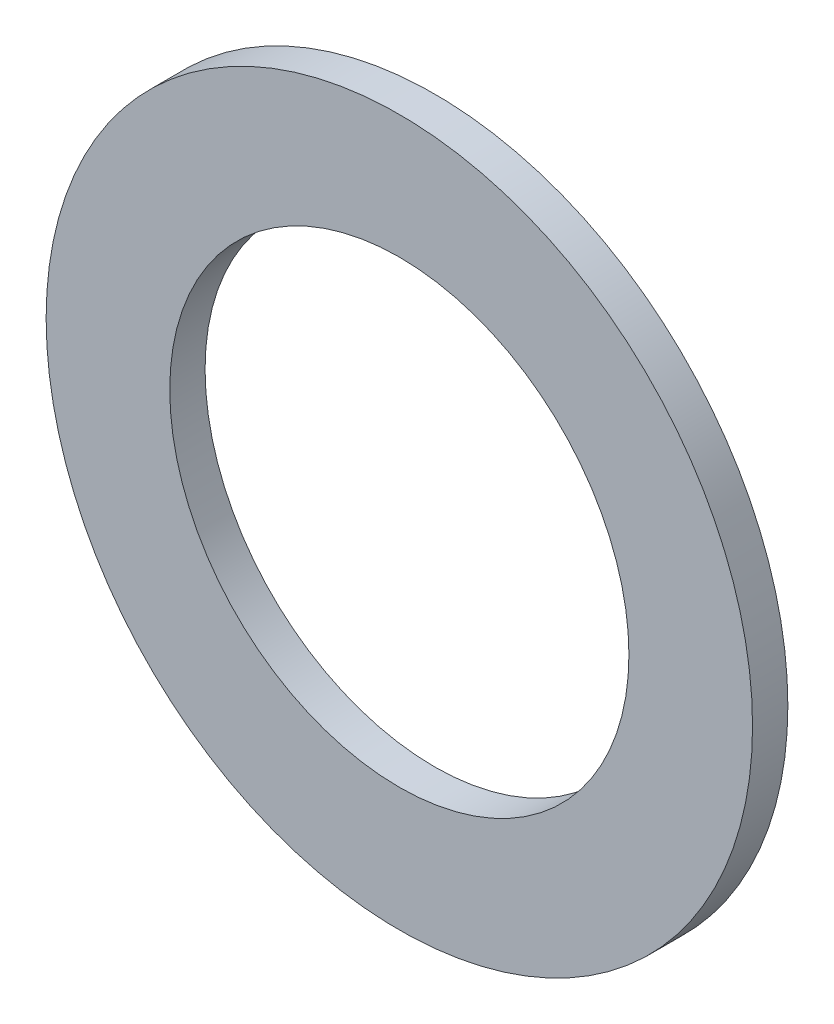
ISO-10303-21;
HEADER;
FILE_DESCRIPTION(('STEP AP214'),'2;1');
FILE_NAME('part.step','',(''),(''),'','','');
FILE_SCHEMA(('AUTOMOTIVE_DESIGN { 1 0 10303 214 1 1 1 1 }'));
ENDSEC;
DATA;
#1=APPLICATION_CONTEXT('core data for automotive mechanical design processes');
#2=APPLICATION_PROTOCOL_DEFINITION('international standard','automotive_design',2000,#1);
#3=PRODUCT_CONTEXT('',#1,'mechanical');
#4=PRODUCT('Part','Part','',(#3));
#5=PRODUCT_RELATED_PRODUCT_CATEGORY('part','',(#4));
#6=PRODUCT_DEFINITION_FORMATION('','',#4);
#7=PRODUCT_DEFINITION_CONTEXT('part definition',#1,'design');
#8=PRODUCT_DEFINITION('design','',#6,#7);
#9=PRODUCT_DEFINITION_SHAPE('','',#8);
#10=(LENGTH_UNIT() NAMED_UNIT(*) SI_UNIT(.MILLI.,.METRE.));
#11=(NAMED_UNIT(*) PLANE_ANGLE_UNIT() SI_UNIT($,.RADIAN.));
#12=(NAMED_UNIT(*) SI_UNIT($,.STERADIAN.) SOLID_ANGLE_UNIT());
#13=UNCERTAINTY_MEASURE_WITH_UNIT(LENGTH_MEASURE(1.E-05),#10,'distance_accuracy_value','');
#14=(GEOMETRIC_REPRESENTATION_CONTEXT(3) GLOBAL_UNCERTAINTY_ASSIGNED_CONTEXT((#13)) GLOBAL_UNIT_ASSIGNED_CONTEXT((#10,
#11,#12)) REPRESENTATION_CONTEXT('',''));
#15=CARTESIAN_POINT('',(0.,0.,0.));
#16=DIRECTION('',(0.,0.,1.));
#17=DIRECTION('',(1.,0.,0.));
#18=AXIS2_PLACEMENT_3D('',#15,#16,#17);
#19=CARTESIAN_POINT('',(0.,0.,0.5));
#20=DIRECTION('',(0.,0.,1.));
#21=DIRECTION('',(1.,0.,0.));
#22=AXIS2_PLACEMENT_3D('',#19,#20,#21);
#23=PLANE('',#22);
#24=CARTESIAN_POINT('',(0.,0.,0.5));
#25=DIRECTION('',(0.,0.,1.));
#26=DIRECTION('',(1.,0.,0.));
#27=AXIS2_PLACEMENT_3D('',#24,#25,#26);
#28=CIRCLE('',#27,5.);
#29=CARTESIAN_POINT('',(5.,0.,0.5));
#30=VERTEX_POINT('',#29);
#31=EDGE_CURVE('E10',#30,#30,#28,.T.);
#32=ORIENTED_EDGE('',*,*,#31,.T.);
#33=EDGE_LOOP('',(#32));
#34=FACE_BOUND('',#33,.T.);
#35=CARTESIAN_POINT('',(0.,0.,0.5));
#36=DIRECTION('',(0.,0.,1.));
#37=DIRECTION('',(1.,0.,0.));
#38=AXIS2_PLACEMENT_3D('',#35,#36,#37);
#39=CIRCLE('',#38,3.25);
#40=CARTESIAN_POINT('',(3.25,0.,0.5));
#41=VERTEX_POINT('',#40);
#42=EDGE_CURVE('E41',#41,#41,#39,.T.);
#43=ORIENTED_EDGE('',*,*,#42,.F.);
#44=EDGE_LOOP('',(#43));
#45=FACE_BOUND('',#44,.T.);
#46=ADVANCED_FACE('F30',(#34,#45),#23,.T.);
#47=CARTESIAN_POINT('',(0.,0.,0.));
#48=DIRECTION('',(0.,0.,1.));
#49=DIRECTION('',(1.,0.,0.));
#50=AXIS2_PLACEMENT_3D('',#47,#48,#49);
#51=PLANE('',#50);
#52=CARTESIAN_POINT('',(0.,0.,0.));
#53=DIRECTION('',(0.,0.,1.));
#54=DIRECTION('',(1.,0.,0.));
#55=AXIS2_PLACEMENT_3D('',#52,#53,#54);
#56=CIRCLE('',#55,5.);
#57=CARTESIAN_POINT('',(5.,0.,0.));
#58=VERTEX_POINT('',#57);
#59=EDGE_CURVE('E34',#58,#58,#56,.T.);
#60=ORIENTED_EDGE('',*,*,#59,.F.);
#61=EDGE_LOOP('',(#60));
#62=FACE_BOUND('',#61,.T.);
#63=CARTESIAN_POINT('',(0.,0.,0.));
#64=DIRECTION('',(0.,0.,1.));
#65=DIRECTION('',(1.,0.,0.));
#66=AXIS2_PLACEMENT_3D('',#63,#64,#65);
#67=CIRCLE('',#66,3.25);
#68=CARTESIAN_POINT('',(3.25,0.,0.));
#69=VERTEX_POINT('',#68);
#70=EDGE_CURVE('E43',#69,#69,#67,.T.);
#71=ORIENTED_EDGE('',*,*,#70,.T.);
#72=EDGE_LOOP('',(#71));
#73=FACE_BOUND('',#72,.T.);
#74=ADVANCED_FACE('F53',(#62,#73),#51,.F.);
#75=CARTESIAN_POINT('',(0.,0.,0.5));
#76=DIRECTION('',(0.,0.,-1.));
#77=DIRECTION('',(-1.,0.,0.));
#78=AXIS2_PLACEMENT_3D('',#75,#76,#77);
#79=CYLINDRICAL_SURFACE('',#78,5.);
#80=ORIENTED_EDGE('',*,*,#31,.F.);
#81=EDGE_LOOP('',(#80));
#82=FACE_BOUND('',#81,.T.);
#83=ORIENTED_EDGE('',*,*,#59,.T.);
#84=EDGE_LOOP('',(#83));
#85=FACE_BOUND('',#84,.T.);
#86=ADVANCED_FACE('F32',(#82,#85),#79,.T.);
#87=CARTESIAN_POINT('',(0.,0.,0.5));
#88=DIRECTION('',(0.,0.,-1.));
#89=DIRECTION('',(-1.,0.,0.));
#90=AXIS2_PLACEMENT_3D('',#87,#88,#89);
#91=CYLINDRICAL_SURFACE('',#90,3.25);
#92=ORIENTED_EDGE('',*,*,#42,.T.);
#93=EDGE_LOOP('',(#92));
#94=FACE_BOUND('',#93,.T.);
#95=ORIENTED_EDGE('',*,*,#70,.F.);
#96=EDGE_LOOP('',(#95));
#97=FACE_BOUND('',#96,.T.);
#98=ADVANCED_FACE('F49',(#94,#97),#91,.F.);
#99=CLOSED_SHELL('',(#46,#74,#86,#98));
#100=MANIFOLD_SOLID_BREP('B2',#99);
#101=ADVANCED_BREP_SHAPE_REPRESENTATION('',(#18,#100),#14);
#102=SHAPE_DEFINITION_REPRESENTATION(#9,#101);
ENDSEC;
END-ISO-10303-21;
